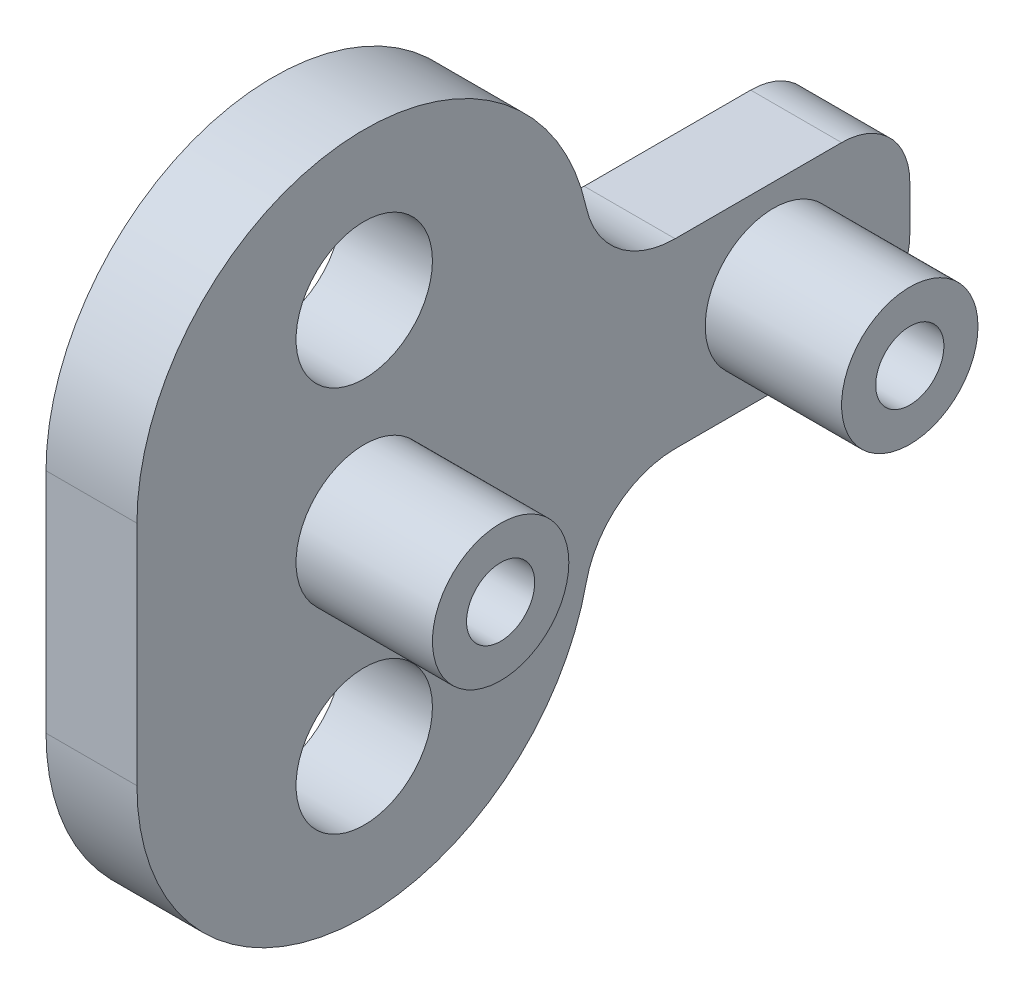
ISO-10303-21;
HEADER;
FILE_DESCRIPTION(('STEP AP214'),'2;1');
FILE_NAME('part.step','',(''),(''),'','','');
FILE_SCHEMA(('AUTOMOTIVE_DESIGN { 1 0 10303 214 1 1 1 1 }'));
ENDSEC;
DATA;
#1=APPLICATION_CONTEXT('core data for automotive mechanical design processes');
#2=APPLICATION_PROTOCOL_DEFINITION('international standard','automotive_design',2000,#1);
#3=PRODUCT_CONTEXT('',#1,'mechanical');
#4=PRODUCT('Part','Part','',(#3));
#5=PRODUCT_RELATED_PRODUCT_CATEGORY('part','',(#4));
#6=PRODUCT_DEFINITION_FORMATION('','',#4);
#7=PRODUCT_DEFINITION_CONTEXT('part definition',#1,'design');
#8=PRODUCT_DEFINITION('design','',#6,#7);
#9=PRODUCT_DEFINITION_SHAPE('','',#8);
#10=(LENGTH_UNIT() NAMED_UNIT(*) SI_UNIT(.MILLI.,.METRE.));
#11=(NAMED_UNIT(*) PLANE_ANGLE_UNIT() SI_UNIT($,.RADIAN.));
#12=(NAMED_UNIT(*) SI_UNIT($,.STERADIAN.) SOLID_ANGLE_UNIT());
#13=UNCERTAINTY_MEASURE_WITH_UNIT(LENGTH_MEASURE(1.E-05),#10,'distance_accuracy_value','');
#14=(GEOMETRIC_REPRESENTATION_CONTEXT(3) GLOBAL_UNCERTAINTY_ASSIGNED_CONTEXT((#13)) GLOBAL_UNIT_ASSIGNED_CONTEXT((#10,
#11,#12)) REPRESENTATION_CONTEXT('',''));
#15=CARTESIAN_POINT('',(0.,0.,0.));
#16=DIRECTION('',(0.,0.,1.));
#17=DIRECTION('',(1.,0.,0.));
#18=AXIS2_PLACEMENT_3D('',#15,#16,#17);
#19=CARTESIAN_POINT('',(20.,88.9722738265991,96.0431370620583));
#20=DIRECTION('',(0.,0.,-1.));
#21=DIRECTION('',(-1.,0.,0.));
#22=AXIS2_PLACEMENT_3D('',#19,#20,#21);
#23=PLANE('',#22);
#24=DIRECTION('',(0.,1.,0.));
#25=VECTOR('',#24,1.);
#26=CARTESIAN_POINT('',(20.,88.9722738265991,96.0431370620583));
#27=LINE('',#26,#25);
#28=CARTESIAN_POINT('',(20.,91.9722738265991,96.0431370620583));
#29=VERTEX_POINT('',#28);
#30=CARTESIAN_POINT('',(20.,93.9722738265991,96.0431370620583));
#31=VERTEX_POINT('',#30);
#32=EDGE_CURVE('E153',#29,#31,#27,.T.);
#33=ORIENTED_EDGE('',*,*,#32,.T.);
#34=DIRECTION('',(1.,0.,0.));
#35=VECTOR('',#34,1.);
#36=CARTESIAN_POINT('',(20.,93.9722738265991,96.0431370620583));
#37=LINE('',#36,#35);
#38=CARTESIAN_POINT('',(24.,93.9722738265991,96.0431370620583));
#39=VERTEX_POINT('',#38);
#40=EDGE_CURVE('E163',#31,#39,#37,.T.);
#41=ORIENTED_EDGE('',*,*,#40,.T.);
#42=DIRECTION('',(0.,1.,0.));
#43=VECTOR('',#42,1.);
#44=CARTESIAN_POINT('',(24.,88.9722738265991,96.0431370620583));
#45=LINE('',#44,#43);
#46=CARTESIAN_POINT('',(24.,91.9722738265991,96.0431370620583));
#47=VERTEX_POINT('',#46);
#48=EDGE_CURVE('E139',#47,#39,#45,.T.);
#49=ORIENTED_EDGE('',*,*,#48,.F.);
#50=DIRECTION('',(1.,0.,0.));
#51=VECTOR('',#50,1.);
#52=CARTESIAN_POINT('',(20.,91.9722738265991,96.0431370620583));
#53=LINE('',#52,#51);
#54=EDGE_CURVE('E161',#47,#29,#53,.F.);
#55=ORIENTED_EDGE('',*,*,#54,.T.);
#56=EDGE_LOOP('',(#33,#41,#49,#55));
#57=FACE_BOUND('',#56,.T.);
#58=ADVANCED_FACE('F32',(#57),#23,.T.);
#59=CARTESIAN_POINT('',(20.,88.9722738265991,110.093262690992));
#60=DIRECTION('',(0.,-1.,0.));
#61=DIRECTION('',(0.,0.,-1.));
#62=AXIS2_PLACEMENT_3D('',#59,#60,#61);
#63=PLANE('',#62);
#64=DIRECTION('',(0.,0.,-1.));
#65=VECTOR('',#64,1.);
#66=CARTESIAN_POINT('',(24.,88.9722738265991,110.093262690992));
#67=LINE('',#66,#65);
#68=CARTESIAN_POINT('',(24.,88.9722738265991,106.368342730881));
#69=VERTEX_POINT('',#68);
#70=CARTESIAN_POINT('',(24.,88.9722738265991,99.0431370620583));
#71=VERTEX_POINT('',#70);
#72=EDGE_CURVE('E151',#69,#71,#67,.T.);
#73=ORIENTED_EDGE('',*,*,#72,.F.);
#74=DIRECTION('',(-1.,0.,0.));
#75=VECTOR('',#74,1.);
#76=CARTESIAN_POINT('',(20.,88.9722738265991,106.368342730881));
#77=LINE('',#76,#75);
#78=CARTESIAN_POINT('',(20.,88.9722738265991,106.368342730881));
#79=VERTEX_POINT('',#78);
#80=EDGE_CURVE('E53',#69,#79,#77,.T.);
#81=ORIENTED_EDGE('',*,*,#80,.T.);
#82=DIRECTION('',(0.,0.,-1.));
#83=VECTOR('',#82,1.);
#84=CARTESIAN_POINT('',(20.,88.9722738265991,110.093262690992));
#85=LINE('',#84,#83);
#86=CARTESIAN_POINT('',(20.,88.9722738265991,99.0431370620583));
#87=VERTEX_POINT('',#86);
#88=EDGE_CURVE('E127',#79,#87,#85,.T.);
#89=ORIENTED_EDGE('',*,*,#88,.T.);
#90=DIRECTION('',(1.,0.,0.));
#91=VECTOR('',#90,1.);
#92=CARTESIAN_POINT('',(20.,88.9722738265991,99.0431370620583));
#93=LINE('',#92,#91);
#94=EDGE_CURVE('E177',#87,#71,#93,.T.);
#95=ORIENTED_EDGE('',*,*,#94,.T.);
#96=EDGE_LOOP('',(#73,#81,#89,#95));
#97=FACE_BOUND('',#96,.T.);
#98=ADVANCED_FACE('F272',(#97),#63,.T.);
#99=CARTESIAN_POINT('',(20.,87.9722738265991,120.043137062058));
#100=DIRECTION('',(1.,0.,0.));
#101=DIRECTION('',(0.,0.,-1.));
#102=AXIS2_PLACEMENT_3D('',#99,#100,#101);
#103=CYLINDRICAL_SURFACE('',#102,9.99999999999999);
#104=CARTESIAN_POINT('',(20.,87.9722738265991,120.043137062058));
#105=DIRECTION('',(1.,0.,0.));
#106=DIRECTION('',(0.,0.,-1.));
#107=AXIS2_PLACEMENT_3D('',#104,#105,#106);
#108=CIRCLE('',#107,9.99999999999999);
#109=CARTESIAN_POINT('',(20.,87.9722738265991,130.043137062058));
#110=VERTEX_POINT('',#109);
#111=CARTESIAN_POINT('',(20.,85.829416683742,110.275426825503));
#112=VERTEX_POINT('',#111);
#113=EDGE_CURVE('E133',#110,#112,#108,.T.);
#114=ORIENTED_EDGE('',*,*,#113,.T.);
#115=DIRECTION('',(1.,0.,0.));
#116=VECTOR('',#115,1.);
#117=CARTESIAN_POINT('',(20.,85.829416683742,110.275426825503));
#118=LINE('',#117,#116);
#119=CARTESIAN_POINT('',(24.,85.829416683742,110.275426825503));
#120=VERTEX_POINT('',#119);
#121=EDGE_CURVE('E184',#112,#120,#118,.T.);
#122=ORIENTED_EDGE('',*,*,#121,.T.);
#123=CARTESIAN_POINT('',(24.,87.9722738265991,120.043137062058));
#124=DIRECTION('',(1.,0.,0.));
#125=DIRECTION('',(0.,0.,-1.));
#126=AXIS2_PLACEMENT_3D('',#123,#124,#125);
#127=CIRCLE('',#126,9.99999999999999);
#128=CARTESIAN_POINT('',(24.,87.9722738265991,130.043137062058));
#129=VERTEX_POINT('',#128);
#130=EDGE_CURVE('E149',#129,#120,#127,.T.);
#131=ORIENTED_EDGE('',*,*,#130,.F.);
#132=DIRECTION('',(1.,0.,0.));
#133=VECTOR('',#132,1.);
#134=CARTESIAN_POINT('',(20.,87.9722738265991,130.043137062058));
#135=LINE('',#134,#133);
#136=EDGE_CURVE('E126',#110,#129,#135,.T.);
#137=ORIENTED_EDGE('',*,*,#136,.F.);
#138=EDGE_LOOP('',(#114,#122,#131,#137));
#139=FACE_BOUND('',#138,.T.);
#140=ADVANCED_FACE('F277',(#139),#103,.T.);
#141=CARTESIAN_POINT('',(20.,97.9722738265991,130.043137062058));
#142=DIRECTION('',(0.,0.,1.));
#143=DIRECTION('',(1.,0.,0.));
#144=AXIS2_PLACEMENT_3D('',#141,#142,#143);
#145=PLANE('',#144);
#146=DIRECTION('',(0.,-1.,0.));
#147=VECTOR('',#146,1.);
#148=CARTESIAN_POINT('',(24.,97.9722738265991,130.043137062058));
#149=LINE('',#148,#147);
#150=CARTESIAN_POINT('',(24.,97.9722738265991,130.043137062058));
#151=VERTEX_POINT('',#150);
#152=EDGE_CURVE('E125',#151,#129,#149,.T.);
#153=ORIENTED_EDGE('',*,*,#152,.F.);
#154=DIRECTION('',(1.,0.,0.));
#155=VECTOR('',#154,1.);
#156=CARTESIAN_POINT('',(20.,97.9722738265991,130.043137062058));
#157=LINE('',#156,#155);
#158=CARTESIAN_POINT('',(20.,97.9722738265991,130.043137062058));
#159=VERTEX_POINT('',#158);
#160=EDGE_CURVE('E111',#159,#151,#157,.T.);
#161=ORIENTED_EDGE('',*,*,#160,.F.);
#162=DIRECTION('',(0.,-1.,0.));
#163=VECTOR('',#162,1.);
#164=CARTESIAN_POINT('',(20.,97.9722738265991,130.043137062058));
#165=LINE('',#164,#163);
#166=EDGE_CURVE('E118',#159,#110,#165,.T.);
#167=ORIENTED_EDGE('',*,*,#166,.T.);
#168=ORIENTED_EDGE('',*,*,#136,.T.);
#169=EDGE_LOOP('',(#153,#161,#167,#168));
#170=FACE_BOUND('',#169,.T.);
#171=ADVANCED_FACE('F123',(#170),#145,.T.);
#172=CARTESIAN_POINT('',(20.,97.9722738265991,120.043137062058));
#173=DIRECTION('',(1.,0.,0.));
#174=DIRECTION('',(0.,0.,-1.));
#175=AXIS2_PLACEMENT_3D('',#172,#173,#174);
#176=CYLINDRICAL_SURFACE('',#175,10.);
#177=CARTESIAN_POINT('',(24.,97.9722738265991,120.043137062058));
#178=DIRECTION('',(1.,0.,0.));
#179=DIRECTION('',(0.,0.,-1.));
#180=AXIS2_PLACEMENT_3D('',#177,#178,#179);
#181=CIRCLE('',#180,10.);
#182=CARTESIAN_POINT('',(24.,100.115130969456,110.275426825503));
#183=VERTEX_POINT('',#182);
#184=EDGE_CURVE('E146',#183,#151,#181,.T.);
#185=ORIENTED_EDGE('',*,*,#184,.F.);
#186=DIRECTION('',(1.,0.,0.));
#187=VECTOR('',#186,1.);
#188=CARTESIAN_POINT('',(20.,100.115130969456,110.275426825503));
#189=LINE('',#188,#187);
#190=CARTESIAN_POINT('',(20.,100.115130969456,110.275426825503));
#191=VERTEX_POINT('',#190);
#192=EDGE_CURVE('E114',#183,#191,#189,.F.);
#193=ORIENTED_EDGE('',*,*,#192,.T.);
#194=CARTESIAN_POINT('',(20.,97.9722738265991,120.043137062058));
#195=DIRECTION('',(1.,0.,0.));
#196=DIRECTION('',(0.,0.,-1.));
#197=AXIS2_PLACEMENT_3D('',#194,#195,#196);
#198=CIRCLE('',#197,10.);
#199=EDGE_CURVE('E107',#191,#159,#198,.T.);
#200=ORIENTED_EDGE('',*,*,#199,.T.);
#201=ORIENTED_EDGE('',*,*,#160,.T.);
#202=EDGE_LOOP('',(#185,#193,#200,#201));
#203=FACE_BOUND('',#202,.T.);
#204=ADVANCED_FACE('F110',(#203),#176,.T.);
#205=CARTESIAN_POINT('',(20.,96.9722738265991,96.0431370620583));
#206=DIRECTION('',(0.,1.,0.));
#207=DIRECTION('',(0.,0.,1.));
#208=AXIS2_PLACEMENT_3D('',#205,#206,#207);
#209=PLANE('',#208);
#210=DIRECTION('',(0.,0.,1.));
#211=VECTOR('',#210,1.);
#212=CARTESIAN_POINT('',(20.,96.9722738265991,96.0431370620583));
#213=LINE('',#212,#211);
#214=CARTESIAN_POINT('',(20.,96.9722738265991,99.0431370620583));
#215=VERTEX_POINT('',#214);
#216=CARTESIAN_POINT('',(20.,96.9722738265991,106.368342730881));
#217=VERTEX_POINT('',#216);
#218=EDGE_CURVE('E119',#215,#217,#213,.T.);
#219=ORIENTED_EDGE('',*,*,#218,.T.);
#220=DIRECTION('',(-1.,0.,0.));
#221=VECTOR('',#220,1.);
#222=CARTESIAN_POINT('',(24.,96.9722738265991,106.368342730881));
#223=LINE('',#222,#221);
#224=CARTESIAN_POINT('',(24.,96.9722738265991,106.368342730881));
#225=VERTEX_POINT('',#224);
#226=EDGE_CURVE('E180',#217,#225,#223,.F.);
#227=ORIENTED_EDGE('',*,*,#226,.T.);
#228=DIRECTION('',(0.,0.,1.));
#229=VECTOR('',#228,1.);
#230=CARTESIAN_POINT('',(24.,96.9722738265991,96.0431370620583));
#231=LINE('',#230,#229);
#232=CARTESIAN_POINT('',(24.,96.9722738265991,99.0431370620583));
#233=VERTEX_POINT('',#232);
#234=EDGE_CURVE('E142',#233,#225,#231,.T.);
#235=ORIENTED_EDGE('',*,*,#234,.F.);
#236=DIRECTION('',(1.,0.,0.));
#237=VECTOR('',#236,1.);
#238=CARTESIAN_POINT('',(20.,96.9722738265991,99.0431370620583));
#239=LINE('',#238,#237);
#240=EDGE_CURVE('E170',#233,#215,#239,.F.);
#241=ORIENTED_EDGE('',*,*,#240,.T.);
#242=EDGE_LOOP('',(#219,#227,#235,#241));
#243=FACE_BOUND('',#242,.T.);
#244=ADVANCED_FACE('F196',(#243),#209,.T.);
#245=CARTESIAN_POINT('',(20.,97.9722738265991,120.043137062058));
#246=DIRECTION('',(1.,0.,0.));
#247=DIRECTION('',(0.,0.,-1.));
#248=AXIS2_PLACEMENT_3D('',#245,#246,#247);
#249=PLANE('',#248);
#250=CARTESIAN_POINT('',(20.,101.472273826599,120.043137062058));
#251=DIRECTION('',(1.,0.,0.));
#252=DIRECTION('',(0.,0.,-1.));
#253=AXIS2_PLACEMENT_3D('',#250,#251,#252);
#254=CIRCLE('',#253,2.99999999999998);
#255=CARTESIAN_POINT('',(20.,101.472273826599,117.043137062058));
#256=VERTEX_POINT('',#255);
#257=EDGE_CURVE('E235',#256,#256,#254,.T.);
#258=ORIENTED_EDGE('',*,*,#257,.T.);
#259=EDGE_LOOP('',(#258));
#260=FACE_BOUND('',#259,.T.);
#261=CARTESIAN_POINT('',(20.,84.4722738265991,120.043137062058));
#262=DIRECTION('',(1.,0.,0.));
#263=DIRECTION('',(0.,0.,-1.));
#264=AXIS2_PLACEMENT_3D('',#261,#262,#263);
#265=CIRCLE('',#264,2.99999999999998);
#266=CARTESIAN_POINT('',(20.,84.4722738265991,117.043137062058));
#267=VERTEX_POINT('',#266);
#268=EDGE_CURVE('E229',#267,#267,#265,.T.);
#269=ORIENTED_EDGE('',*,*,#268,.T.);
#270=EDGE_LOOP('',(#269));
#271=FACE_BOUND('',#270,.T.);
#272=CARTESIAN_POINT('',(20.,92.9722738265991,120.043137062058));
#273=DIRECTION('',(1.,0.,0.));
#274=DIRECTION('',(0.,0.,-1.));
#275=AXIS2_PLACEMENT_3D('',#272,#273,#274);
#276=CIRCLE('',#275,1.49999999999999);
#277=CARTESIAN_POINT('',(20.,92.9722738265991,118.543137062058));
#278=VERTEX_POINT('',#277);
#279=EDGE_CURVE('E223',#278,#278,#276,.T.);
#280=ORIENTED_EDGE('',*,*,#279,.T.);
#281=EDGE_LOOP('',(#280));
#282=FACE_BOUND('',#281,.T.);
#283=CARTESIAN_POINT('',(20.,92.9722738265991,102.043137062058));
#284=DIRECTION('',(1.,0.,0.));
#285=DIRECTION('',(0.,0.,-1.));
#286=AXIS2_PLACEMENT_3D('',#283,#284,#285);
#287=CIRCLE('',#286,1.49999999999999);
#288=CARTESIAN_POINT('',(20.,92.9722738265991,100.543137062058));
#289=VERTEX_POINT('',#288);
#290=EDGE_CURVE('E217',#289,#289,#287,.T.);
#291=ORIENTED_EDGE('',*,*,#290,.T.);
#292=EDGE_LOOP('',(#291));
#293=FACE_BOUND('',#292,.T.);
#294=ORIENTED_EDGE('',*,*,#218,.F.);
#295=CARTESIAN_POINT('',(20.,93.9722738265991,99.0431370620583));
#296=DIRECTION('',(1.,0.,0.));
#297=DIRECTION('',(0.,0.,-1.));
#298=AXIS2_PLACEMENT_3D('',#295,#296,#297);
#299=CIRCLE('',#298,2.99999999999999);
#300=EDGE_CURVE('E175',#215,#31,#299,.F.);
#301=ORIENTED_EDGE('',*,*,#300,.T.);
#302=ORIENTED_EDGE('',*,*,#32,.F.);
#303=CARTESIAN_POINT('',(20.,91.9722738265991,99.0431370620583));
#304=DIRECTION('',(1.,0.,0.));
#305=DIRECTION('',(0.,0.,-1.));
#306=AXIS2_PLACEMENT_3D('',#303,#304,#305);
#307=CIRCLE('',#306,2.99999999999999);
#308=EDGE_CURVE('E172',#29,#87,#307,.F.);
#309=ORIENTED_EDGE('',*,*,#308,.T.);
#310=ORIENTED_EDGE('',*,*,#88,.F.);
#311=CARTESIAN_POINT('',(20.,84.9722738265991,106.368342730881));
#312=DIRECTION('',(1.,0.,0.));
#313=DIRECTION('',(0.,0.,-1.));
#314=AXIS2_PLACEMENT_3D('',#311,#312,#313);
#315=CIRCLE('',#314,4.);
#316=EDGE_CURVE('E11',#79,#112,#315,.T.);
#317=ORIENTED_EDGE('',*,*,#316,.T.);
#318=ORIENTED_EDGE('',*,*,#113,.F.);
#319=ORIENTED_EDGE('',*,*,#166,.F.);
#320=ORIENTED_EDGE('',*,*,#199,.F.);
#321=CARTESIAN_POINT('',(20.,100.972273826599,106.368342730881));
#322=DIRECTION('',(1.,0.,0.));
#323=DIRECTION('',(0.,0.,-1.));
#324=AXIS2_PLACEMENT_3D('',#321,#322,#323);
#325=CIRCLE('',#324,4.);
#326=EDGE_CURVE('E190',#191,#217,#325,.T.);
#327=ORIENTED_EDGE('',*,*,#326,.T.);
#328=EDGE_LOOP('',(#294,#301,#302,#309,#310,#317,#318,#319,#320,#327));
#329=FACE_BOUND('',#328,.T.);
#330=ADVANCED_FACE('F131',(#260,#271,#282,#293,#329),#249,.F.);
#331=CARTESIAN_POINT('',(24.,97.9722738265991,120.043137062058));
#332=DIRECTION('',(1.,0.,0.));
#333=DIRECTION('',(0.,0.,-1.));
#334=AXIS2_PLACEMENT_3D('',#331,#332,#333);
#335=PLANE('',#334);
#336=CARTESIAN_POINT('',(24.,101.472273826599,120.043137062058));
#337=DIRECTION('',(1.,0.,0.));
#338=DIRECTION('',(0.,0.,-1.));
#339=AXIS2_PLACEMENT_3D('',#336,#337,#338);
#340=CIRCLE('',#339,2.99999999999998);
#341=CARTESIAN_POINT('',(24.,101.472273826599,117.043137062058));
#342=VERTEX_POINT('',#341);
#343=EDGE_CURVE('E238',#342,#342,#340,.T.);
#344=ORIENTED_EDGE('',*,*,#343,.F.);
#345=EDGE_LOOP('',(#344));
#346=FACE_BOUND('',#345,.T.);
#347=CARTESIAN_POINT('',(24.,84.4722738265991,120.043137062058));
#348=DIRECTION('',(1.,0.,0.));
#349=DIRECTION('',(0.,0.,-1.));
#350=AXIS2_PLACEMENT_3D('',#347,#348,#349);
#351=CIRCLE('',#350,2.99999999999998);
#352=CARTESIAN_POINT('',(24.,84.4722738265991,117.043137062058));
#353=VERTEX_POINT('',#352);
#354=EDGE_CURVE('E232',#353,#353,#351,.T.);
#355=ORIENTED_EDGE('',*,*,#354,.F.);
#356=EDGE_LOOP('',(#355));
#357=FACE_BOUND('',#356,.T.);
#358=CARTESIAN_POINT('',(24.,92.9722738265991,120.043137062058));
#359=DIRECTION('',(1.,0.,0.));
#360=DIRECTION('',(0.,0.,-1.));
#361=AXIS2_PLACEMENT_3D('',#358,#359,#360);
#362=CIRCLE('',#361,3.00000000000002);
#363=CARTESIAN_POINT('',(24.,92.9722738265991,117.043137062058));
#364=VERTEX_POINT('',#363);
#365=EDGE_CURVE('E158',#364,#364,#362,.T.);
#366=ORIENTED_EDGE('',*,*,#365,.F.);
#367=EDGE_LOOP('',(#366));
#368=FACE_BOUND('',#367,.T.);
#369=CARTESIAN_POINT('',(24.,92.9722738265991,102.043137062058));
#370=DIRECTION('',(1.,0.,0.));
#371=DIRECTION('',(0.,0.,-1.));
#372=AXIS2_PLACEMENT_3D('',#369,#370,#371);
#373=CIRCLE('',#372,2.99999999999999);
#374=CARTESIAN_POINT('',(24.,92.9722738265991,99.043137062058));
#375=VERTEX_POINT('',#374);
#376=EDGE_CURVE('E154',#375,#375,#373,.T.);
#377=ORIENTED_EDGE('',*,*,#376,.F.);
#378=EDGE_LOOP('',(#377));
#379=FACE_BOUND('',#378,.T.);
#380=ORIENTED_EDGE('',*,*,#48,.T.);
#381=CARTESIAN_POINT('',(24.,93.9722738265991,99.0431370620583));
#382=DIRECTION('',(1.,0.,0.));
#383=DIRECTION('',(0.,0.,-1.));
#384=AXIS2_PLACEMENT_3D('',#381,#382,#383);
#385=CIRCLE('',#384,2.99999999999999);
#386=EDGE_CURVE('E168',#39,#233,#385,.T.);
#387=ORIENTED_EDGE('',*,*,#386,.T.);
#388=ORIENTED_EDGE('',*,*,#234,.T.);
#389=CARTESIAN_POINT('',(24.,100.972273826599,106.368342730881));
#390=DIRECTION('',(1.,0.,0.));
#391=DIRECTION('',(0.,0.,-1.));
#392=AXIS2_PLACEMENT_3D('',#389,#390,#391);
#393=CIRCLE('',#392,4.);
#394=EDGE_CURVE('E188',#225,#183,#393,.F.);
#395=ORIENTED_EDGE('',*,*,#394,.T.);
#396=ORIENTED_EDGE('',*,*,#184,.T.);
#397=ORIENTED_EDGE('',*,*,#152,.T.);
#398=ORIENTED_EDGE('',*,*,#130,.T.);
#399=CARTESIAN_POINT('',(24.,84.9722738265991,106.368342730881));
#400=DIRECTION('',(1.,0.,0.));
#401=DIRECTION('',(0.,0.,-1.));
#402=AXIS2_PLACEMENT_3D('',#399,#400,#401);
#403=CIRCLE('',#402,4.);
#404=EDGE_CURVE('E40',#120,#69,#403,.F.);
#405=ORIENTED_EDGE('',*,*,#404,.T.);
#406=ORIENTED_EDGE('',*,*,#72,.T.);
#407=CARTESIAN_POINT('',(24.,91.9722738265991,99.0431370620583));
#408=DIRECTION('',(1.,0.,0.));
#409=DIRECTION('',(0.,0.,-1.));
#410=AXIS2_PLACEMENT_3D('',#407,#408,#409);
#411=CIRCLE('',#410,2.99999999999999);
#412=EDGE_CURVE('E166',#71,#47,#411,.T.);
#413=ORIENTED_EDGE('',*,*,#412,.T.);
#414=EDGE_LOOP('',(#380,#387,#388,#395,#396,#397,#398,#405,#406,#413));
#415=FACE_BOUND('',#414,.T.);
#416=ADVANCED_FACE('F200',(#346,#357,#368,#379,#415),#335,.T.);
#417=CARTESIAN_POINT('',(24.,92.9722738265991,102.043137062058));
#418=DIRECTION('',(1.,0.,0.));
#419=DIRECTION('',(0.,0.,-1.));
#420=AXIS2_PLACEMENT_3D('',#417,#418,#419);
#421=CYLINDRICAL_SURFACE('',#420,2.99999999999999);
#422=ORIENTED_EDGE('',*,*,#376,.T.);
#423=EDGE_LOOP('',(#422));
#424=FACE_BOUND('',#423,.T.);
#425=CARTESIAN_POINT('',(30.,92.9722738265991,102.043137062058));
#426=DIRECTION('',(1.,0.,0.));
#427=DIRECTION('',(0.,0.,-1.));
#428=AXIS2_PLACEMENT_3D('',#425,#426,#427);
#429=CIRCLE('',#428,2.99999999999999);
#430=CARTESIAN_POINT('',(30.,92.9722738265991,99.043137062058));
#431=VERTEX_POINT('',#430);
#432=EDGE_CURVE('E143',#431,#431,#429,.T.);
#433=ORIENTED_EDGE('',*,*,#432,.F.);
#434=EDGE_LOOP('',(#433));
#435=FACE_BOUND('',#434,.T.);
#436=ADVANCED_FACE('F246',(#424,#435),#421,.T.);
#437=CARTESIAN_POINT('',(30.,92.9722738265991,102.043137062058));
#438=DIRECTION('',(1.,0.,0.));
#439=DIRECTION('',(0.,0.,-1.));
#440=AXIS2_PLACEMENT_3D('',#437,#438,#439);
#441=PLANE('',#440);
#442=CARTESIAN_POINT('',(30.,92.9722738265991,102.043137062058));
#443=DIRECTION('',(1.,0.,0.));
#444=DIRECTION('',(0.,0.,-1.));
#445=AXIS2_PLACEMENT_3D('',#442,#443,#444);
#446=CIRCLE('',#445,1.49999999999999);
#447=CARTESIAN_POINT('',(30.,92.9722738265991,100.543137062058));
#448=VERTEX_POINT('',#447);
#449=EDGE_CURVE('E220',#448,#448,#446,.T.);
#450=ORIENTED_EDGE('',*,*,#449,.F.);
#451=EDGE_LOOP('',(#450));
#452=FACE_BOUND('',#451,.T.);
#453=ORIENTED_EDGE('',*,*,#432,.T.);
#454=EDGE_LOOP('',(#453));
#455=FACE_BOUND('',#454,.T.);
#456=ADVANCED_FACE('F256',(#452,#455),#441,.T.);
#457=CARTESIAN_POINT('',(24.,92.9722738265991,120.043137062058));
#458=DIRECTION('',(1.,0.,0.));
#459=DIRECTION('',(0.,0.,-1.));
#460=AXIS2_PLACEMENT_3D('',#457,#458,#459);
#461=CYLINDRICAL_SURFACE('',#460,3.00000000000002);
#462=ORIENTED_EDGE('',*,*,#365,.T.);
#463=EDGE_LOOP('',(#462));
#464=FACE_BOUND('',#463,.T.);
#465=CARTESIAN_POINT('',(30.,92.9722738265991,120.043137062058));
#466=DIRECTION('',(1.,0.,0.));
#467=DIRECTION('',(0.,0.,-1.));
#468=AXIS2_PLACEMENT_3D('',#465,#466,#467);
#469=CIRCLE('',#468,3.00000000000002);
#470=CARTESIAN_POINT('',(30.,92.9722738265991,117.043137062058));
#471=VERTEX_POINT('',#470);
#472=EDGE_CURVE('E214',#471,#471,#469,.T.);
#473=ORIENTED_EDGE('',*,*,#472,.F.);
#474=EDGE_LOOP('',(#473));
#475=FACE_BOUND('',#474,.T.);
#476=ADVANCED_FACE('F261',(#464,#475),#461,.T.);
#477=CARTESIAN_POINT('',(30.,92.9722738265991,120.043137062058));
#478=DIRECTION('',(1.,0.,0.));
#479=DIRECTION('',(0.,0.,-1.));
#480=AXIS2_PLACEMENT_3D('',#477,#478,#479);
#481=PLANE('',#480);
#482=CARTESIAN_POINT('',(30.,92.9722738265991,120.043137062058));
#483=DIRECTION('',(1.,0.,0.));
#484=DIRECTION('',(0.,0.,-1.));
#485=AXIS2_PLACEMENT_3D('',#482,#483,#484);
#486=CIRCLE('',#485,1.49999999999999);
#487=CARTESIAN_POINT('',(30.,92.9722738265991,118.543137062058));
#488=VERTEX_POINT('',#487);
#489=EDGE_CURVE('E226',#488,#488,#486,.T.);
#490=ORIENTED_EDGE('',*,*,#489,.F.);
#491=EDGE_LOOP('',(#490));
#492=FACE_BOUND('',#491,.T.);
#493=ORIENTED_EDGE('',*,*,#472,.T.);
#494=EDGE_LOOP('',(#493));
#495=FACE_BOUND('',#494,.T.);
#496=ADVANCED_FACE('F267',(#492,#495),#481,.T.);
#497=CARTESIAN_POINT('',(30.,92.9722738265991,102.043137062058));
#498=DIRECTION('',(1.,0.,0.));
#499=DIRECTION('',(0.,0.,-1.));
#500=AXIS2_PLACEMENT_3D('',#497,#498,#499);
#501=CYLINDRICAL_SURFACE('',#500,1.49999999999999);
#502=ORIENTED_EDGE('',*,*,#290,.F.);
#503=EDGE_LOOP('',(#502));
#504=FACE_BOUND('',#503,.T.);
#505=ORIENTED_EDGE('',*,*,#449,.T.);
#506=EDGE_LOOP('',(#505));
#507=FACE_BOUND('',#506,.T.);
#508=ADVANCED_FACE('F323',(#504,#507),#501,.F.);
#509=CARTESIAN_POINT('',(30.,92.9722738265991,120.043137062058));
#510=DIRECTION('',(1.,0.,0.));
#511=DIRECTION('',(0.,0.,-1.));
#512=AXIS2_PLACEMENT_3D('',#509,#510,#511);
#513=CYLINDRICAL_SURFACE('',#512,1.49999999999999);
#514=ORIENTED_EDGE('',*,*,#279,.F.);
#515=EDGE_LOOP('',(#514));
#516=FACE_BOUND('',#515,.T.);
#517=ORIENTED_EDGE('',*,*,#489,.T.);
#518=EDGE_LOOP('',(#517));
#519=FACE_BOUND('',#518,.T.);
#520=ADVANCED_FACE('F326',(#516,#519),#513,.F.);
#521=CARTESIAN_POINT('',(24.,84.4722738265991,120.043137062058));
#522=DIRECTION('',(1.,0.,0.));
#523=DIRECTION('',(0.,0.,-1.));
#524=AXIS2_PLACEMENT_3D('',#521,#522,#523);
#525=CYLINDRICAL_SURFACE('',#524,2.99999999999998);
#526=ORIENTED_EDGE('',*,*,#268,.F.);
#527=EDGE_LOOP('',(#526));
#528=FACE_BOUND('',#527,.T.);
#529=ORIENTED_EDGE('',*,*,#354,.T.);
#530=EDGE_LOOP('',(#529));
#531=FACE_BOUND('',#530,.T.);
#532=ADVANCED_FACE('F332',(#528,#531),#525,.F.);
#533=CARTESIAN_POINT('',(24.,101.472273826599,120.043137062058));
#534=DIRECTION('',(1.,0.,0.));
#535=DIRECTION('',(0.,0.,-1.));
#536=AXIS2_PLACEMENT_3D('',#533,#534,#535);
#537=CYLINDRICAL_SURFACE('',#536,2.99999999999998);
#538=ORIENTED_EDGE('',*,*,#257,.F.);
#539=EDGE_LOOP('',(#538));
#540=FACE_BOUND('',#539,.T.);
#541=ORIENTED_EDGE('',*,*,#343,.T.);
#542=EDGE_LOOP('',(#541));
#543=FACE_BOUND('',#542,.T.);
#544=ADVANCED_FACE('F242',(#540,#543),#537,.F.);
#545=CARTESIAN_POINT('',(20.,93.9722738265991,99.0431370620583));
#546=DIRECTION('',(1.,0.,0.));
#547=DIRECTION('',(0.,0.,-1.));
#548=AXIS2_PLACEMENT_3D('',#545,#546,#547);
#549=CYLINDRICAL_SURFACE('',#548,2.99999999999999);
#550=ORIENTED_EDGE('',*,*,#300,.F.);
#551=ORIENTED_EDGE('',*,*,#240,.F.);
#552=ORIENTED_EDGE('',*,*,#386,.F.);
#553=ORIENTED_EDGE('',*,*,#40,.F.);
#554=EDGE_LOOP('',(#550,#551,#552,#553));
#555=FACE_BOUND('',#554,.T.);
#556=ADVANCED_FACE('F202',(#555),#549,.T.);
#557=CARTESIAN_POINT('',(20.,91.9722738265991,99.0431370620583));
#558=DIRECTION('',(1.,0.,0.));
#559=DIRECTION('',(0.,0.,-1.));
#560=AXIS2_PLACEMENT_3D('',#557,#558,#559);
#561=CYLINDRICAL_SURFACE('',#560,2.99999999999999);
#562=ORIENTED_EDGE('',*,*,#308,.F.);
#563=ORIENTED_EDGE('',*,*,#54,.F.);
#564=ORIENTED_EDGE('',*,*,#412,.F.);
#565=ORIENTED_EDGE('',*,*,#94,.F.);
#566=EDGE_LOOP('',(#562,#563,#564,#565));
#567=FACE_BOUND('',#566,.T.);
#568=ADVANCED_FACE('F284',(#567),#561,.T.);
#569=CARTESIAN_POINT('',(20.,100.972273826599,106.368342730881));
#570=DIRECTION('',(1.,0.,0.));
#571=DIRECTION('',(0.,0.,-1.));
#572=AXIS2_PLACEMENT_3D('',#569,#570,#571);
#573=CYLINDRICAL_SURFACE('',#572,4.);
#574=ORIENTED_EDGE('',*,*,#326,.F.);
#575=ORIENTED_EDGE('',*,*,#192,.F.);
#576=ORIENTED_EDGE('',*,*,#394,.F.);
#577=ORIENTED_EDGE('',*,*,#226,.F.);
#578=EDGE_LOOP('',(#574,#575,#576,#577));
#579=FACE_BOUND('',#578,.T.);
#580=ADVANCED_FACE('F199',(#579),#573,.F.);
#581=CARTESIAN_POINT('',(20.,84.9722738265991,106.368342730881));
#582=DIRECTION('',(1.,0.,0.));
#583=DIRECTION('',(0.,0.,-1.));
#584=AXIS2_PLACEMENT_3D('',#581,#582,#583);
#585=CYLINDRICAL_SURFACE('',#584,4.);
#586=ORIENTED_EDGE('',*,*,#316,.F.);
#587=ORIENTED_EDGE('',*,*,#80,.F.);
#588=ORIENTED_EDGE('',*,*,#404,.F.);
#589=ORIENTED_EDGE('',*,*,#121,.F.);
#590=EDGE_LOOP('',(#586,#587,#588,#589));
#591=FACE_BOUND('',#590,.T.);
#592=ADVANCED_FACE('F34',(#591),#585,.F.);
#593=CLOSED_SHELL('',(#58,#98,#140,#171,#204,#244,#330,#416,#436,#456,#476,#496,#508,#520,#532,
#544,#556,#568,#580,#592));
#594=MANIFOLD_SOLID_BREP('B2',#593);
#595=ADVANCED_BREP_SHAPE_REPRESENTATION('',(#18,#594),#14);
#596=SHAPE_DEFINITION_REPRESENTATION(#9,#595);
ENDSEC;
END-ISO-10303-21;
